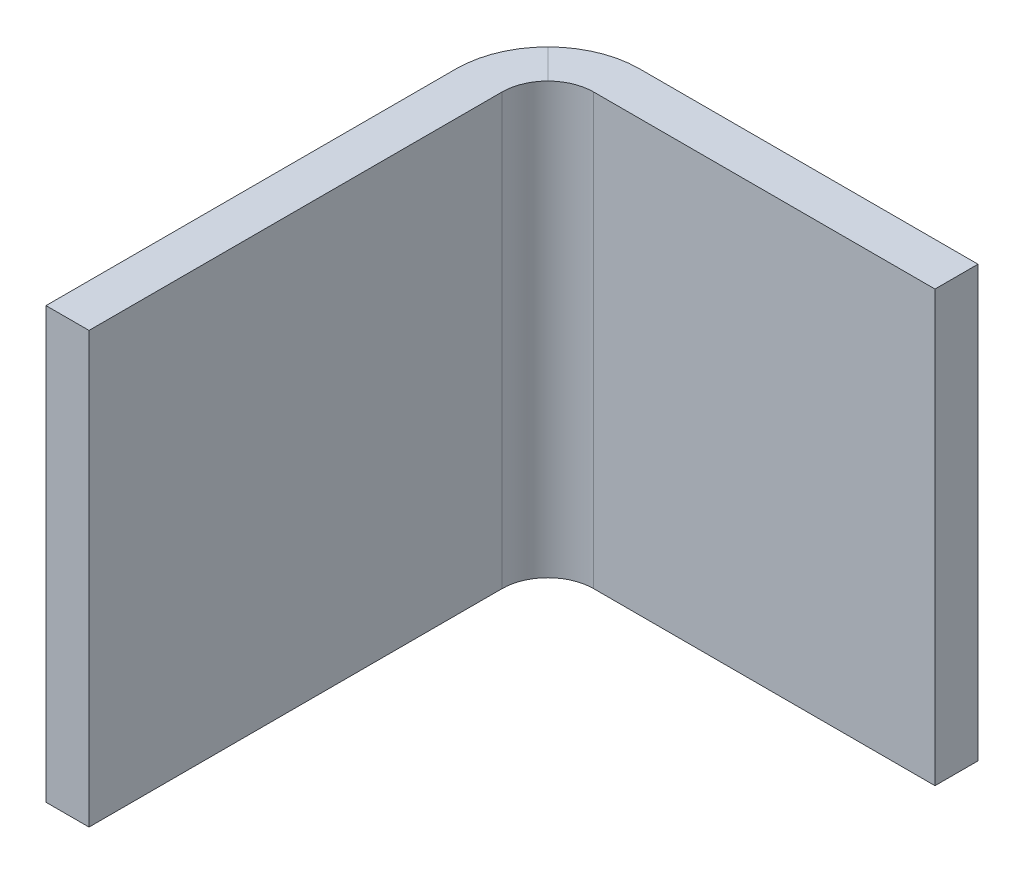
ISO-10303-21;
HEADER;
FILE_DESCRIPTION(('STEP AP214'),'2;1');
FILE_NAME('part.step','',(''),(''),'','','');
FILE_SCHEMA(('AUTOMOTIVE_DESIGN { 1 0 10303 214 1 1 1 1 }'));
ENDSEC;
DATA;
#1=APPLICATION_CONTEXT('core data for automotive mechanical design processes');
#2=APPLICATION_PROTOCOL_DEFINITION('international standard','automotive_design',2000,#1);
#3=PRODUCT_CONTEXT('',#1,'mechanical');
#4=PRODUCT('Part','Part','',(#3));
#5=PRODUCT_RELATED_PRODUCT_CATEGORY('part','',(#4));
#6=PRODUCT_DEFINITION_FORMATION('','',#4);
#7=PRODUCT_DEFINITION_CONTEXT('part definition',#1,'design');
#8=PRODUCT_DEFINITION('design','',#6,#7);
#9=PRODUCT_DEFINITION_SHAPE('','',#8);
#10=(LENGTH_UNIT() NAMED_UNIT(*) SI_UNIT(.MILLI.,.METRE.));
#11=(NAMED_UNIT(*) PLANE_ANGLE_UNIT() SI_UNIT($,.RADIAN.));
#12=(NAMED_UNIT(*) SI_UNIT($,.STERADIAN.) SOLID_ANGLE_UNIT());
#13=UNCERTAINTY_MEASURE_WITH_UNIT(LENGTH_MEASURE(1.E-05),#10,'distance_accuracy_value','');
#14=(GEOMETRIC_REPRESENTATION_CONTEXT(3) GLOBAL_UNCERTAINTY_ASSIGNED_CONTEXT((#13)) GLOBAL_UNIT_ASSIGNED_CONTEXT((#10,
#11,#12)) REPRESENTATION_CONTEXT('',''));
#15=CARTESIAN_POINT('',(0.,0.,0.));
#16=DIRECTION('',(0.,0.,1.));
#17=DIRECTION('',(1.,0.,0.));
#18=AXIS2_PLACEMENT_3D('',#15,#16,#17);
#19=CARTESIAN_POINT('',(30.,0.,-35.));
#20=DIRECTION('',(-1.,0.,0.));
#21=DIRECTION('',(0.,0.,1.));
#22=AXIS2_PLACEMENT_3D('',#19,#20,#21);
#23=PLANE('',#22);
#24=DIRECTION('',(0.,1.,0.));
#25=VECTOR('',#24,1.);
#26=CARTESIAN_POINT('',(30.,-15.,-32.));
#27=LINE('',#26,#25);
#28=CARTESIAN_POINT('',(30.,-15.,-32.));
#29=VERTEX_POINT('',#28);
#30=CARTESIAN_POINT('',(30.,15.,-32.));
#31=VERTEX_POINT('',#30);
#32=EDGE_CURVE('E163',#29,#31,#27,.T.);
#33=ORIENTED_EDGE('',*,*,#32,.F.);
#34=DIRECTION('',(0.,0.,1.));
#35=VECTOR('',#34,1.);
#36=CARTESIAN_POINT('',(30.,-15.,-32.));
#37=LINE('',#36,#35);
#38=CARTESIAN_POINT('',(30.,-15.,-35.));
#39=VERTEX_POINT('',#38);
#40=EDGE_CURVE('E149',#39,#29,#37,.T.);
#41=ORIENTED_EDGE('',*,*,#40,.F.);
#42=DIRECTION('',(0.,-1.,0.));
#43=VECTOR('',#42,1.);
#44=CARTESIAN_POINT('',(30.,-15.,-35.));
#45=LINE('',#44,#43);
#46=CARTESIAN_POINT('',(30.,15.,-35.));
#47=VERTEX_POINT('',#46);
#48=EDGE_CURVE('E154',#47,#39,#45,.T.);
#49=ORIENTED_EDGE('',*,*,#48,.F.);
#50=DIRECTION('',(0.,0.,-1.));
#51=VECTOR('',#50,1.);
#52=CARTESIAN_POINT('',(30.,15.,-32.));
#53=LINE('',#52,#51);
#54=EDGE_CURVE('E159',#31,#47,#53,.T.);
#55=ORIENTED_EDGE('',*,*,#54,.F.);
#56=EDGE_LOOP('',(#33,#41,#49,#55));
#57=FACE_BOUND('',#56,.T.);
#58=ADVANCED_FACE('F32',(#57),#23,.F.);
#59=CARTESIAN_POINT('',(0.,0.,0.));
#60=DIRECTION('',(0.,0.,1.));
#61=DIRECTION('',(1.,0.,0.));
#62=AXIS2_PLACEMENT_3D('',#59,#60,#61);
#63=PLANE('',#62);
#64=DIRECTION('',(0.,1.,0.));
#65=VECTOR('',#64,1.);
#66=CARTESIAN_POINT('',(2.99999999999999,-15.,0.));
#67=LINE('',#66,#65);
#68=CARTESIAN_POINT('',(2.99999999999999,-15.,0.));
#69=VERTEX_POINT('',#68);
#70=CARTESIAN_POINT('',(2.99999999999998,15.,0.));
#71=VERTEX_POINT('',#70);
#72=EDGE_CURVE('E140',#69,#71,#67,.T.);
#73=ORIENTED_EDGE('',*,*,#72,.T.);
#74=DIRECTION('',(-1.,0.,0.));
#75=VECTOR('',#74,1.);
#76=CARTESIAN_POINT('',(2.99999999999998,15.,0.));
#77=LINE('',#76,#75);
#78=CARTESIAN_POINT('',(0.,15.,0.));
#79=VERTEX_POINT('',#78);
#80=EDGE_CURVE('E122',#71,#79,#77,.T.);
#81=ORIENTED_EDGE('',*,*,#80,.T.);
#82=DIRECTION('',(0.,-1.,0.));
#83=VECTOR('',#82,1.);
#84=CARTESIAN_POINT('',(0.,-15.,0.));
#85=LINE('',#84,#83);
#86=CARTESIAN_POINT('',(0.,-15.,0.));
#87=VERTEX_POINT('',#86);
#88=EDGE_CURVE('E118',#79,#87,#85,.T.);
#89=ORIENTED_EDGE('',*,*,#88,.T.);
#90=DIRECTION('',(1.,0.,0.));
#91=VECTOR('',#90,1.);
#92=CARTESIAN_POINT('',(2.99999999999999,-15.,0.));
#93=LINE('',#92,#91);
#94=EDGE_CURVE('E109',#87,#69,#93,.T.);
#95=ORIENTED_EDGE('',*,*,#94,.T.);
#96=EDGE_LOOP('',(#73,#81,#89,#95));
#97=FACE_BOUND('',#96,.T.);
#98=ADVANCED_FACE('F121',(#97),#63,.T.);
#99=CARTESIAN_POINT('',(0.,-15.,-32.));
#100=DIRECTION('',(0.,0.,-1.));
#101=DIRECTION('',(0.,1.,0.));
#102=AXIS2_PLACEMENT_3D('',#99,#100,#101);
#103=PLANE('',#102);
#104=DIRECTION('',(1.,0.,0.));
#105=VECTOR('',#104,1.);
#106=CARTESIAN_POINT('',(0.,15.,-32.));
#107=LINE('',#106,#105);
#108=CARTESIAN_POINT('',(6.19999999999998,15.,-32.));
#109=VERTEX_POINT('',#108);
#110=EDGE_CURVE('E162',#109,#31,#107,.T.);
#111=ORIENTED_EDGE('',*,*,#110,.F.);
#112=DIRECTION('',(0.,-1.,0.));
#113=VECTOR('',#112,1.);
#114=CARTESIAN_POINT('',(6.19999999999999,-15.,-32.));
#115=LINE('',#114,#113);
#116=CARTESIAN_POINT('',(6.19999999999999,-15.,-32.));
#117=VERTEX_POINT('',#116);
#118=EDGE_CURVE('E141',#109,#117,#115,.T.);
#119=ORIENTED_EDGE('',*,*,#118,.T.);
#120=DIRECTION('',(1.,0.,0.));
#121=VECTOR('',#120,1.);
#122=CARTESIAN_POINT('',(0.,-15.,-32.));
#123=LINE('',#122,#121);
#124=EDGE_CURVE('E145',#117,#29,#123,.T.);
#125=ORIENTED_EDGE('',*,*,#124,.T.);
#126=ORIENTED_EDGE('',*,*,#32,.T.);
#127=EDGE_LOOP('',(#111,#119,#125,#126));
#128=FACE_BOUND('',#127,.T.);
#129=ADVANCED_FACE('F204',(#128),#103,.F.);
#130=CARTESIAN_POINT('',(0.,15.,-32.));
#131=DIRECTION('',(0.,-1.,0.));
#132=DIRECTION('',(0.,0.,-1.));
#133=AXIS2_PLACEMENT_3D('',#130,#131,#132);
#134=PLANE('',#133);
#135=DIRECTION('',(1.,0.,0.));
#136=VECTOR('',#135,1.);
#137=CARTESIAN_POINT('',(0.,15.,-35.));
#138=LINE('',#137,#136);
#139=CARTESIAN_POINT('',(6.4,15.,-35.));
#140=VERTEX_POINT('',#139);
#141=EDGE_CURVE('E157',#140,#47,#138,.T.);
#142=ORIENTED_EDGE('',*,*,#141,.F.);
#143=CARTESIAN_POINT('',(6.4,15.,-28.6));
#144=DIRECTION('',(0.,-1.,0.));
#145=DIRECTION('',(0.,0.,-1.));
#146=AXIS2_PLACEMENT_3D('',#143,#144,#145);
#147=CIRCLE('',#146,6.4);
#148=CARTESIAN_POINT('',(1.87451660040609,15.,-33.1254833995939));
#149=VERTEX_POINT('',#148);
#150=EDGE_CURVE('E40',#140,#149,#147,.F.);
#151=ORIENTED_EDGE('',*,*,#150,.T.);
#152=DIRECTION('',(0.707106781186548,0.,0.707106781186548));
#153=VECTOR('',#152,1.);
#154=CARTESIAN_POINT('',(19.,15.,-16.));
#155=LINE('',#154,#153);
#156=CARTESIAN_POINT('',(3.93725830020303,15.,-31.062741699797));
#157=VERTEX_POINT('',#156);
#158=EDGE_CURVE('E132',#149,#157,#155,.T.);
#159=ORIENTED_EDGE('',*,*,#158,.T.);
#160=CARTESIAN_POINT('',(6.19999999999998,15.,-28.8));
#161=DIRECTION('',(0.,-1.,0.));
#162=DIRECTION('',(0.,0.,-1.));
#163=AXIS2_PLACEMENT_3D('',#160,#161,#162);
#164=CIRCLE('',#163,3.2);
#165=EDGE_CURVE('E180',#157,#109,#164,.T.);
#166=ORIENTED_EDGE('',*,*,#165,.T.);
#167=ORIENTED_EDGE('',*,*,#110,.T.);
#168=ORIENTED_EDGE('',*,*,#54,.T.);
#169=EDGE_LOOP('',(#142,#151,#159,#166,#167,#168));
#170=FACE_BOUND('',#169,.T.);
#171=ADVANCED_FACE('F199',(#170),#134,.F.);
#172=CARTESIAN_POINT('',(0.,-15.,-35.));
#173=DIRECTION('',(0.,0.,1.));
#174=DIRECTION('',(0.,-1.,0.));
#175=AXIS2_PLACEMENT_3D('',#172,#173,#174);
#176=PLANE('',#175);
#177=DIRECTION('',(1.,0.,0.));
#178=VECTOR('',#177,1.);
#179=CARTESIAN_POINT('',(0.,-15.,-35.));
#180=LINE('',#179,#178);
#181=CARTESIAN_POINT('',(6.4,-15.,-35.));
#182=VERTEX_POINT('',#181);
#183=EDGE_CURVE('E152',#182,#39,#180,.T.);
#184=ORIENTED_EDGE('',*,*,#183,.F.);
#185=DIRECTION('',(0.,-1.,0.));
#186=VECTOR('',#185,1.);
#187=CARTESIAN_POINT('',(6.4,-15.,-35.));
#188=LINE('',#187,#186);
#189=EDGE_CURVE('E54',#182,#140,#188,.F.);
#190=ORIENTED_EDGE('',*,*,#189,.T.);
#191=ORIENTED_EDGE('',*,*,#141,.T.);
#192=ORIENTED_EDGE('',*,*,#48,.T.);
#193=EDGE_LOOP('',(#184,#190,#191,#192));
#194=FACE_BOUND('',#193,.T.);
#195=ADVANCED_FACE('F191',(#194),#176,.F.);
#196=CARTESIAN_POINT('',(0.,-15.,-32.));
#197=DIRECTION('',(0.,1.,0.));
#198=DIRECTION('',(0.,0.,1.));
#199=AXIS2_PLACEMENT_3D('',#196,#197,#198);
#200=PLANE('',#199);
#201=DIRECTION('',(-0.707106781186548,0.,-0.707106781186548));
#202=VECTOR('',#201,1.);
#203=CARTESIAN_POINT('',(19.,-15.,-16.));
#204=LINE('',#203,#202);
#205=CARTESIAN_POINT('',(3.93725830020304,-15.,-31.062741699797));
#206=VERTEX_POINT('',#205);
#207=CARTESIAN_POINT('',(1.87451660040609,-15.,-33.1254833995939));
#208=VERTEX_POINT('',#207);
#209=EDGE_CURVE('E136',#206,#208,#204,.T.);
#210=ORIENTED_EDGE('',*,*,#209,.T.);
#211=CARTESIAN_POINT('',(6.4,-15.,-28.6));
#212=DIRECTION('',(0.,1.,0.));
#213=DIRECTION('',(0.,0.,1.));
#214=AXIS2_PLACEMENT_3D('',#211,#212,#213);
#215=CIRCLE('',#214,6.4);
#216=EDGE_CURVE('E185',#208,#182,#215,.F.);
#217=ORIENTED_EDGE('',*,*,#216,.T.);
#218=ORIENTED_EDGE('',*,*,#183,.T.);
#219=ORIENTED_EDGE('',*,*,#40,.T.);
#220=ORIENTED_EDGE('',*,*,#124,.F.);
#221=CARTESIAN_POINT('',(6.19999999999999,-15.,-28.8));
#222=DIRECTION('',(0.,1.,0.));
#223=DIRECTION('',(0.,0.,1.));
#224=AXIS2_PLACEMENT_3D('',#221,#222,#223);
#225=CIRCLE('',#224,3.2);
#226=EDGE_CURVE('E172',#117,#206,#225,.T.);
#227=ORIENTED_EDGE('',*,*,#226,.T.);
#228=EDGE_LOOP('',(#210,#217,#218,#219,#220,#227));
#229=FACE_BOUND('',#228,.T.);
#230=ADVANCED_FACE('F189',(#229),#200,.F.);
#231=CARTESIAN_POINT('',(0.,-15.,0.));
#232=DIRECTION('',(1.,0.,0.));
#233=DIRECTION('',(0.,1.,0.));
#234=AXIS2_PLACEMENT_3D('',#231,#232,#233);
#235=PLANE('',#234);
#236=DIRECTION('',(0.,0.,-1.));
#237=VECTOR('',#236,1.);
#238=CARTESIAN_POINT('',(0.,15.,0.));
#239=LINE('',#238,#237);
#240=CARTESIAN_POINT('',(0.,15.,-28.6));
#241=VERTEX_POINT('',#240);
#242=EDGE_CURVE('E131',#79,#241,#239,.T.);
#243=ORIENTED_EDGE('',*,*,#242,.T.);
#244=DIRECTION('',(0.,-1.,0.));
#245=VECTOR('',#244,1.);
#246=CARTESIAN_POINT('',(0.,-15.,-28.6));
#247=LINE('',#246,#245);
#248=CARTESIAN_POINT('',(0.,-15.,-28.6));
#249=VERTEX_POINT('',#248);
#250=EDGE_CURVE('E130',#241,#249,#247,.T.);
#251=ORIENTED_EDGE('',*,*,#250,.T.);
#252=DIRECTION('',(0.,0.,-1.));
#253=VECTOR('',#252,1.);
#254=CARTESIAN_POINT('',(0.,-15.,0.));
#255=LINE('',#254,#253);
#256=EDGE_CURVE('E113',#87,#249,#255,.T.);
#257=ORIENTED_EDGE('',*,*,#256,.F.);
#258=ORIENTED_EDGE('',*,*,#88,.F.);
#259=EDGE_LOOP('',(#243,#251,#257,#258));
#260=FACE_BOUND('',#259,.T.);
#261=ADVANCED_FACE('F128',(#260),#235,.F.);
#262=CARTESIAN_POINT('',(2.99999999999999,-15.,0.));
#263=DIRECTION('',(-1.,0.,0.));
#264=DIRECTION('',(0.,-1.,0.));
#265=AXIS2_PLACEMENT_3D('',#262,#263,#264);
#266=PLANE('',#265);
#267=DIRECTION('',(0.,0.,-1.));
#268=VECTOR('',#267,1.);
#269=CARTESIAN_POINT('',(2.99999999999999,-15.,0.));
#270=LINE('',#269,#268);
#271=CARTESIAN_POINT('',(2.99999999999999,-15.,-28.8));
#272=VERTEX_POINT('',#271);
#273=EDGE_CURVE('E115',#69,#272,#270,.T.);
#274=ORIENTED_EDGE('',*,*,#273,.T.);
#275=DIRECTION('',(0.,-1.,0.));
#276=VECTOR('',#275,1.);
#277=CARTESIAN_POINT('',(2.99999999999998,15.,-28.8));
#278=LINE('',#277,#276);
#279=CARTESIAN_POINT('',(2.99999999999998,15.,-28.8));
#280=VERTEX_POINT('',#279);
#281=EDGE_CURVE('E170',#272,#280,#278,.F.);
#282=ORIENTED_EDGE('',*,*,#281,.T.);
#283=DIRECTION('',(0.,0.,-1.));
#284=VECTOR('',#283,1.);
#285=CARTESIAN_POINT('',(2.99999999999998,15.,0.));
#286=LINE('',#285,#284);
#287=EDGE_CURVE('E134',#71,#280,#286,.T.);
#288=ORIENTED_EDGE('',*,*,#287,.F.);
#289=ORIENTED_EDGE('',*,*,#72,.F.);
#290=EDGE_LOOP('',(#274,#282,#288,#289));
#291=FACE_BOUND('',#290,.T.);
#292=ADVANCED_FACE('F224',(#291),#266,.F.);
#293=CARTESIAN_POINT('',(2.99999999999998,15.,0.));
#294=DIRECTION('',(0.,-1.,0.));
#295=DIRECTION('',(0.,0.,-1.));
#296=AXIS2_PLACEMENT_3D('',#293,#294,#295);
#297=PLANE('',#296);
#298=ORIENTED_EDGE('',*,*,#158,.F.);
#299=CARTESIAN_POINT('',(6.4,15.,-28.6));
#300=DIRECTION('',(0.,-1.,0.));
#301=DIRECTION('',(0.,0.,-1.));
#302=AXIS2_PLACEMENT_3D('',#299,#300,#301);
#303=CIRCLE('',#302,6.4);
#304=EDGE_CURVE('E11',#149,#241,#303,.F.);
#305=ORIENTED_EDGE('',*,*,#304,.T.);
#306=ORIENTED_EDGE('',*,*,#242,.F.);
#307=ORIENTED_EDGE('',*,*,#80,.F.);
#308=ORIENTED_EDGE('',*,*,#287,.T.);
#309=CARTESIAN_POINT('',(6.19999999999998,15.,-28.8));
#310=DIRECTION('',(0.,-1.,0.));
#311=DIRECTION('',(0.,0.,-1.));
#312=AXIS2_PLACEMENT_3D('',#309,#310,#311);
#313=CIRCLE('',#312,3.2);
#314=EDGE_CURVE('E177',#280,#157,#313,.T.);
#315=ORIENTED_EDGE('',*,*,#314,.T.);
#316=EDGE_LOOP('',(#298,#305,#306,#307,#308,#315));
#317=FACE_BOUND('',#316,.T.);
#318=ADVANCED_FACE('F196',(#317),#297,.F.);
#319=CARTESIAN_POINT('',(2.99999999999999,-15.,0.));
#320=DIRECTION('',(0.,1.,0.));
#321=DIRECTION('',(0.,0.,1.));
#322=AXIS2_PLACEMENT_3D('',#319,#320,#321);
#323=PLANE('',#322);
#324=ORIENTED_EDGE('',*,*,#256,.T.);
#325=CARTESIAN_POINT('',(6.4,-15.,-28.6));
#326=DIRECTION('',(0.,1.,0.));
#327=DIRECTION('',(0.,0.,1.));
#328=AXIS2_PLACEMENT_3D('',#325,#326,#327);
#329=CIRCLE('',#328,6.4);
#330=EDGE_CURVE('E183',#249,#208,#329,.F.);
#331=ORIENTED_EDGE('',*,*,#330,.T.);
#332=ORIENTED_EDGE('',*,*,#209,.F.);
#333=CARTESIAN_POINT('',(6.19999999999999,-15.,-28.8));
#334=DIRECTION('',(0.,1.,0.));
#335=DIRECTION('',(0.,0.,1.));
#336=AXIS2_PLACEMENT_3D('',#333,#334,#335);
#337=CIRCLE('',#336,3.2);
#338=EDGE_CURVE('E175',#206,#272,#337,.T.);
#339=ORIENTED_EDGE('',*,*,#338,.T.);
#340=ORIENTED_EDGE('',*,*,#273,.F.);
#341=ORIENTED_EDGE('',*,*,#94,.F.);
#342=EDGE_LOOP('',(#324,#331,#332,#339,#340,#341));
#343=FACE_BOUND('',#342,.T.);
#344=ADVANCED_FACE('F111',(#343),#323,.F.);
#345=CARTESIAN_POINT('',(6.19999999999999,-15.,-28.8));
#346=DIRECTION('',(0.,1.,0.));
#347=DIRECTION('',(-1.,0.,0.));
#348=AXIS2_PLACEMENT_3D('',#345,#346,#347);
#349=CYLINDRICAL_SURFACE('',#348,3.2);
#350=ORIENTED_EDGE('',*,*,#314,.F.);
#351=ORIENTED_EDGE('',*,*,#281,.F.);
#352=ORIENTED_EDGE('',*,*,#338,.F.);
#353=ORIENTED_EDGE('',*,*,#226,.F.);
#354=ORIENTED_EDGE('',*,*,#118,.F.);
#355=ORIENTED_EDGE('',*,*,#165,.F.);
#356=EDGE_LOOP('',(#350,#351,#352,#353,#354,#355));
#357=FACE_BOUND('',#356,.T.);
#358=ADVANCED_FACE('F208',(#357),#349,.F.);
#359=CARTESIAN_POINT('',(6.4,-15.,-28.6));
#360=DIRECTION('',(0.,-1.,0.));
#361=DIRECTION('',(0.,0.,-1.));
#362=AXIS2_PLACEMENT_3D('',#359,#360,#361);
#363=CYLINDRICAL_SURFACE('',#362,6.4);
#364=ORIENTED_EDGE('',*,*,#150,.F.);
#365=ORIENTED_EDGE('',*,*,#189,.F.);
#366=ORIENTED_EDGE('',*,*,#216,.F.);
#367=ORIENTED_EDGE('',*,*,#330,.F.);
#368=ORIENTED_EDGE('',*,*,#250,.F.);
#369=ORIENTED_EDGE('',*,*,#304,.F.);
#370=EDGE_LOOP('',(#364,#365,#366,#367,#368,#369));
#371=FACE_BOUND('',#370,.T.);
#372=ADVANCED_FACE('F34',(#371),#363,.T.);
#373=CLOSED_SHELL('',(#58,#98,#129,#171,#195,#230,#261,#292,#318,#344,#358,#372));
#374=MANIFOLD_SOLID_BREP('B2',#373);
#375=ADVANCED_BREP_SHAPE_REPRESENTATION('',(#18,#374),#14);
#376=SHAPE_DEFINITION_REPRESENTATION(#9,#375);
ENDSEC;
END-ISO-10303-21;
